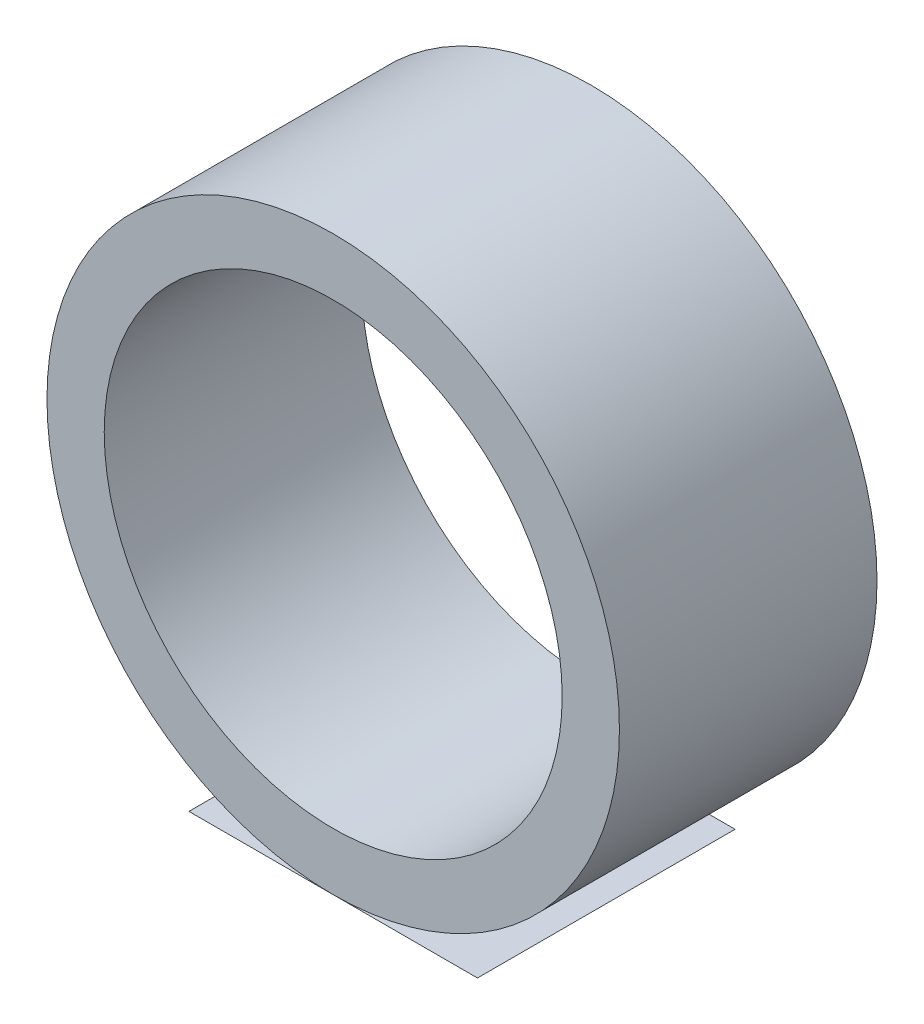
ISO-10303-21;
HEADER;
FILE_DESCRIPTION(('STEP AP214'),'2;1');
FILE_NAME('part.step','',(''),(''),'','','');
FILE_SCHEMA(('AUTOMOTIVE_DESIGN { 1 0 10303 214 1 1 1 1 }'));
ENDSEC;
DATA;
#1=APPLICATION_CONTEXT('core data for automotive mechanical design processes');
#2=APPLICATION_PROTOCOL_DEFINITION('international standard','automotive_design',2000,#1);
#3=PRODUCT_CONTEXT('',#1,'mechanical');
#4=PRODUCT('Part','Part','',(#3));
#5=PRODUCT_RELATED_PRODUCT_CATEGORY('part','',(#4));
#6=PRODUCT_DEFINITION_FORMATION('','',#4);
#7=PRODUCT_DEFINITION_CONTEXT('part definition',#1,'design');
#8=PRODUCT_DEFINITION('design','',#6,#7);
#9=PRODUCT_DEFINITION_SHAPE('','',#8);
#10=(LENGTH_UNIT() NAMED_UNIT(*) SI_UNIT(.MILLI.,.METRE.));
#11=(NAMED_UNIT(*) PLANE_ANGLE_UNIT() SI_UNIT($,.RADIAN.));
#12=(NAMED_UNIT(*) SI_UNIT($,.STERADIAN.) SOLID_ANGLE_UNIT());
#13=UNCERTAINTY_MEASURE_WITH_UNIT(LENGTH_MEASURE(1.E-05),#10,'distance_accuracy_value','');
#14=(GEOMETRIC_REPRESENTATION_CONTEXT(3) GLOBAL_UNCERTAINTY_ASSIGNED_CONTEXT((#13)) GLOBAL_UNIT_ASSIGNED_CONTEXT((#10,
#11,#12)) REPRESENTATION_CONTEXT('',''));
#15=CARTESIAN_POINT('',(0.,0.,0.));
#16=DIRECTION('',(0.,0.,1.));
#17=DIRECTION('',(1.,0.,0.));
#18=AXIS2_PLACEMENT_3D('',#15,#16,#17);
#19=CARTESIAN_POINT('',(10.0821529522701,-20.,-9.));
#20=DIRECTION('',(0.,1.,0.));
#21=DIRECTION('',(0.,0.,1.));
#22=AXIS2_PLACEMENT_3D('',#19,#20,#21);
#23=PLANE('',#22);
#24=DIRECTION('',(-1.,0.,0.));
#25=VECTOR('',#24,1.);
#26=CARTESIAN_POINT('',(10.0821529522701,-20.,9.));
#27=LINE('',#26,#25);
#28=CARTESIAN_POINT('',(10.0821529522701,-20.,9.));
#29=VERTEX_POINT('',#28);
#30=CARTESIAN_POINT('',(-10.0821529522701,-20.,9.));
#31=VERTEX_POINT('',#30);
#32=EDGE_CURVE('E66',#29,#31,#27,.T.);
#33=ORIENTED_EDGE('',*,*,#32,.F.);
#34=DIRECTION('',(0.,0.,1.));
#35=VECTOR('',#34,1.);
#36=CARTESIAN_POINT('',(10.0821529522701,-20.,-9.));
#37=LINE('',#36,#35);
#38=CARTESIAN_POINT('',(10.0821529522701,-20.,-9.));
#39=VERTEX_POINT('',#38);
#40=EDGE_CURVE('E48',#39,#29,#37,.T.);
#41=ORIENTED_EDGE('',*,*,#40,.F.);
#42=DIRECTION('',(-1.,0.,0.));
#43=VECTOR('',#42,1.);
#44=CARTESIAN_POINT('',(10.0821529522701,-20.,-9.));
#45=LINE('',#44,#43);
#46=CARTESIAN_POINT('',(-10.0821529522701,-20.,-9.));
#47=VERTEX_POINT('',#46);
#48=EDGE_CURVE('E54',#39,#47,#45,.T.);
#49=ORIENTED_EDGE('',*,*,#48,.T.);
#50=DIRECTION('',(0.,0.,1.));
#51=VECTOR('',#50,1.);
#52=CARTESIAN_POINT('',(-10.0821529522701,-20.,-9.));
#53=LINE('',#52,#51);
#54=EDGE_CURVE('E12',#47,#31,#53,.T.);
#55=ORIENTED_EDGE('',*,*,#54,.T.);
#56=EDGE_LOOP('',(#33,#41,#49,#55));
#57=FACE_BOUND('',#56,.T.);
#58=ADVANCED_FACE('F47',(#57),#23,.T.);
#59=OPEN_SHELL('',(#58));
#60=SHELL_BASED_SURFACE_MODEL('B2',(#59));
#61=CARTESIAN_POINT('',(0.,0.,9.));
#62=DIRECTION('',(0.,0.,1.));
#63=DIRECTION('',(1.,0.,0.));
#64=AXIS2_PLACEMENT_3D('',#61,#62,#63);
#65=PLANE('',#64);
#66=CARTESIAN_POINT('',(0.,0.,9.));
#67=DIRECTION('',(0.,0.,1.));
#68=DIRECTION('',(1.,0.,0.));
#69=AXIS2_PLACEMENT_3D('',#66,#67,#68);
#70=CIRCLE('',#69,20.);
#71=CARTESIAN_POINT('',(20.,0.,9.));
#72=VERTEX_POINT('',#71);
#73=EDGE_CURVE('E46',#72,#72,#70,.T.);
#74=ORIENTED_EDGE('',*,*,#73,.T.);
#75=EDGE_LOOP('',(#74));
#76=FACE_BOUND('',#75,.T.);
#77=CARTESIAN_POINT('',(0.,0.,9.));
#78=DIRECTION('',(0.,0.,1.));
#79=DIRECTION('',(1.,0.,0.));
#80=AXIS2_PLACEMENT_3D('',#77,#78,#79);
#81=CIRCLE('',#80,16.);
#82=CARTESIAN_POINT('',(16.,0.,9.));
#83=VERTEX_POINT('',#82);
#84=EDGE_CURVE('E102',#83,#83,#81,.T.);
#85=ORIENTED_EDGE('',*,*,#84,.F.);
#86=EDGE_LOOP('',(#85));
#87=FACE_BOUND('',#86,.T.);
#88=ADVANCED_FACE('F91',(#76,#87),#65,.T.);
#89=CARTESIAN_POINT('',(0.,0.,-9.));
#90=DIRECTION('',(0.,0.,1.));
#91=DIRECTION('',(1.,0.,0.));
#92=AXIS2_PLACEMENT_3D('',#89,#90,#91);
#93=PLANE('',#92);
#94=CARTESIAN_POINT('',(0.,0.,-9.));
#95=DIRECTION('',(0.,0.,1.));
#96=DIRECTION('',(1.,0.,0.));
#97=AXIS2_PLACEMENT_3D('',#94,#95,#96);
#98=CIRCLE('',#97,20.);
#99=CARTESIAN_POINT('',(20.,0.,-9.));
#100=VERTEX_POINT('',#99);
#101=EDGE_CURVE('E95',#100,#100,#98,.T.);
#102=ORIENTED_EDGE('',*,*,#101,.F.);
#103=EDGE_LOOP('',(#102));
#104=FACE_BOUND('',#103,.T.);
#105=CARTESIAN_POINT('',(0.,0.,-9.));
#106=DIRECTION('',(0.,0.,1.));
#107=DIRECTION('',(1.,0.,0.));
#108=AXIS2_PLACEMENT_3D('',#105,#106,#107);
#109=CIRCLE('',#108,16.);
#110=CARTESIAN_POINT('',(16.,0.,-9.));
#111=VERTEX_POINT('',#110);
#112=EDGE_CURVE('E104',#111,#111,#109,.T.);
#113=ORIENTED_EDGE('',*,*,#112,.T.);
#114=EDGE_LOOP('',(#113));
#115=FACE_BOUND('',#114,.T.);
#116=ADVANCED_FACE('F114',(#104,#115),#93,.F.);
#117=CARTESIAN_POINT('',(0.,0.,9.));
#118=DIRECTION('',(0.,0.,-1.));
#119=DIRECTION('',(-1.,0.,0.));
#120=AXIS2_PLACEMENT_3D('',#117,#118,#119);
#121=CYLINDRICAL_SURFACE('',#120,20.);
#122=ORIENTED_EDGE('',*,*,#73,.F.);
#123=EDGE_LOOP('',(#122));
#124=FACE_BOUND('',#123,.T.);
#125=ORIENTED_EDGE('',*,*,#101,.T.);
#126=EDGE_LOOP('',(#125));
#127=FACE_BOUND('',#126,.T.);
#128=ADVANCED_FACE('F93',(#124,#127),#121,.T.);
#129=CARTESIAN_POINT('',(0.,0.,9.));
#130=DIRECTION('',(0.,0.,-1.));
#131=DIRECTION('',(-1.,0.,0.));
#132=AXIS2_PLACEMENT_3D('',#129,#130,#131);
#133=CYLINDRICAL_SURFACE('',#132,16.);
#134=ORIENTED_EDGE('',*,*,#84,.T.);
#135=EDGE_LOOP('',(#134));
#136=FACE_BOUND('',#135,.T.);
#137=ORIENTED_EDGE('',*,*,#112,.F.);
#138=EDGE_LOOP('',(#137));
#139=FACE_BOUND('',#138,.T.);
#140=ADVANCED_FACE('F110',(#136,#139),#133,.F.);
#141=CLOSED_SHELL('',(#88,#116,#128,#140));
#142=MANIFOLD_SOLID_BREP('B6',#141);
#143=ADVANCED_BREP_SHAPE_REPRESENTATION('',(#18,#142),#14);
#144=MANIFOLD_SURFACE_SHAPE_REPRESENTATION('',(#18,#60),#14);
#145=SHAPE_REPRESENTATION('',(#18),#14);
#146=SHAPE_DEFINITION_REPRESENTATION(#9,#145);
#147=SHAPE_REPRESENTATION_RELATIONSHIP('','',#145,#143);
#148=SHAPE_REPRESENTATION_RELATIONSHIP('','',#145,#144);
ENDSEC;
END-ISO-10303-21;
